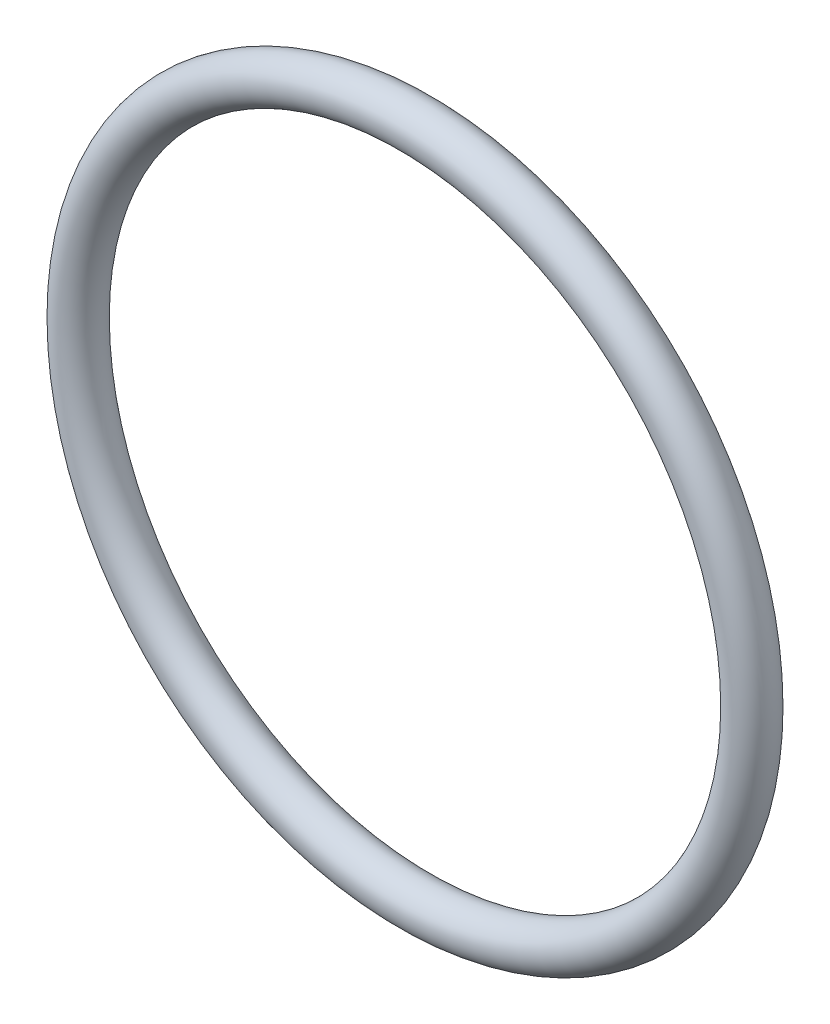
ISO-10303-21;
HEADER;
FILE_DESCRIPTION(('STEP AP214'),'2;1');
FILE_NAME('part.step','',(''),(''),'','','');
FILE_SCHEMA(('AUTOMOTIVE_DESIGN { 1 0 10303 214 1 1 1 1 }'));
ENDSEC;
DATA;
#1=APPLICATION_CONTEXT('core data for automotive mechanical design processes');
#2=APPLICATION_PROTOCOL_DEFINITION('international standard','automotive_design',2000,#1);
#3=PRODUCT_CONTEXT('',#1,'mechanical');
#4=PRODUCT('Part','Part','',(#3));
#5=PRODUCT_RELATED_PRODUCT_CATEGORY('part','',(#4));
#6=PRODUCT_DEFINITION_FORMATION('','',#4);
#7=PRODUCT_DEFINITION_CONTEXT('part definition',#1,'design');
#8=PRODUCT_DEFINITION('design','',#6,#7);
#9=PRODUCT_DEFINITION_SHAPE('','',#8);
#10=(LENGTH_UNIT() NAMED_UNIT(*) SI_UNIT(.MILLI.,.METRE.));
#11=(NAMED_UNIT(*) PLANE_ANGLE_UNIT() SI_UNIT($,.RADIAN.));
#12=(NAMED_UNIT(*) SI_UNIT($,.STERADIAN.) SOLID_ANGLE_UNIT());
#13=UNCERTAINTY_MEASURE_WITH_UNIT(LENGTH_MEASURE(1.E-05),#10,'distance_accuracy_value','');
#14=(GEOMETRIC_REPRESENTATION_CONTEXT(3) GLOBAL_UNCERTAINTY_ASSIGNED_CONTEXT((#13)) GLOBAL_UNIT_ASSIGNED_CONTEXT((#10,
#11,#12)) REPRESENTATION_CONTEXT('',''));
#15=CARTESIAN_POINT('',(0.,0.,0.));
#16=DIRECTION('',(0.,0.,1.));
#17=DIRECTION('',(1.,0.,0.));
#18=AXIS2_PLACEMENT_3D('',#15,#16,#17);
#19=CARTESIAN_POINT('',(0.,0.,0.));
#20=DIRECTION('',(0.,0.,1.));
#21=DIRECTION('',(1.,0.,0.));
#22=AXIS2_PLACEMENT_3D('',#19,#20,#21);
#23=TOROIDAL_SURFACE('',#22,107.,7.00000000000001);
#24=CARTESIAN_POINT('',(107.,0.,0.));
#25=DIRECTION('',(0.,1.,0.));
#26=DIRECTION('',(-1.,0.,0.));
#27=AXIS2_PLACEMENT_3D('',#24,#25,#26);
#28=CIRCLE('',#27,7.00000000000001);
#29=CARTESIAN_POINT('',(114.,0.,0.));
#30=VERTEX_POINT('',#29);
#31=EDGE_CURVE('E11',#30,#30,#28,.T.);
#32=CARTESIAN_POINT('',(0.,0.,0.));
#33=DIRECTION('',(0.,0.,1.));
#34=DIRECTION('',(1.,0.,0.));
#35=AXIS2_PLACEMENT_3D('',#32,#33,#34);
#36=CIRCLE('',#35,114.);
#37=EDGE_CURVE('',#30,#30,#36,.T.);
#38=ORIENTED_EDGE('',*,*,#31,.T.);
#39=ORIENTED_EDGE('',*,*,#31,.F.);
#40=ORIENTED_EDGE('',*,*,#37,.T.);
#41=ORIENTED_EDGE('',*,*,#37,.F.);
#42=EDGE_LOOP('',(#38,#40,#39,#41));
#43=FACE_BOUND('',#42,.T.);
#44=ADVANCED_FACE('F43',(#43),#23,.T.);
#45=CLOSED_SHELL('',(#44));
#46=MANIFOLD_SOLID_BREP('B2',#45);
#47=ADVANCED_BREP_SHAPE_REPRESENTATION('',(#18,#46),#14);
#48=SHAPE_DEFINITION_REPRESENTATION(#9,#47);
ENDSEC;
END-ISO-10303-21;
